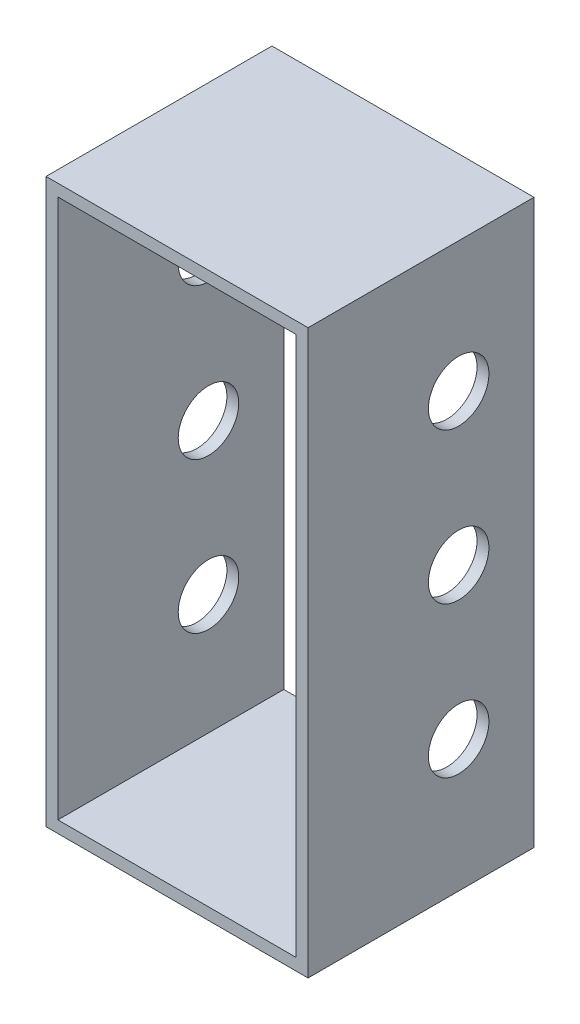
ISO-10303-21;
HEADER;
FILE_DESCRIPTION(('STEP AP214'),'2;1');
FILE_NAME('part.step','',(''),(''),'','','');
FILE_SCHEMA(('AUTOMOTIVE_DESIGN { 1 0 10303 214 1 1 1 1 }'));
ENDSEC;
DATA;
#1=APPLICATION_CONTEXT('core data for automotive mechanical design processes');
#2=APPLICATION_PROTOCOL_DEFINITION('international standard','automotive_design',2000,#1);
#3=PRODUCT_CONTEXT('',#1,'mechanical');
#4=PRODUCT('Part','Part','',(#3));
#5=PRODUCT_RELATED_PRODUCT_CATEGORY('part','',(#4));
#6=PRODUCT_DEFINITION_FORMATION('','',#4);
#7=PRODUCT_DEFINITION_CONTEXT('part definition',#1,'design');
#8=PRODUCT_DEFINITION('design','',#6,#7);
#9=PRODUCT_DEFINITION_SHAPE('','',#8);
#10=(LENGTH_UNIT() NAMED_UNIT(*) SI_UNIT(.MILLI.,.METRE.));
#11=(NAMED_UNIT(*) PLANE_ANGLE_UNIT() SI_UNIT($,.RADIAN.));
#12=(NAMED_UNIT(*) SI_UNIT($,.STERADIAN.) SOLID_ANGLE_UNIT());
#13=UNCERTAINTY_MEASURE_WITH_UNIT(LENGTH_MEASURE(1.E-05),#10,'distance_accuracy_value','');
#14=(GEOMETRIC_REPRESENTATION_CONTEXT(3) GLOBAL_UNCERTAINTY_ASSIGNED_CONTEXT((#13)) GLOBAL_UNIT_ASSIGNED_CONTEXT((#10,
#11,#12)) REPRESENTATION_CONTEXT('',''));
#15=CARTESIAN_POINT('',(0.,0.,0.));
#16=DIRECTION('',(0.,0.,1.));
#17=DIRECTION('',(1.,0.,0.));
#18=AXIS2_PLACEMENT_3D('',#15,#16,#17);
#19=CARTESIAN_POINT('',(0.,23.749,0.));
#20=DIRECTION('',(0.,0.,-1.));
#21=DIRECTION('',(-1.,0.,0.));
#22=AXIS2_PLACEMENT_3D('',#19,#20,#21);
#23=PLANE('',#22);
#24=DIRECTION('',(1.,0.,0.));
#25=VECTOR('',#24,1.);
#26=CARTESIAN_POINT('',(0.,-23.749,0.));
#27=LINE('',#26,#25);
#28=CARTESIAN_POINT('',(0.,-23.749,0.));
#29=VERTEX_POINT('',#28);
#30=CARTESIAN_POINT('',(22.098,-23.749,0.));
#31=VERTEX_POINT('',#30);
#32=EDGE_CURVE('E176',#29,#31,#27,.T.);
#33=ORIENTED_EDGE('',*,*,#32,.T.);
#34=DIRECTION('',(0.,-1.,0.));
#35=VECTOR('',#34,1.);
#36=CARTESIAN_POINT('',(22.098,23.749,0.));
#37=LINE('',#36,#35);
#38=CARTESIAN_POINT('',(22.098,23.749,0.));
#39=VERTEX_POINT('',#38);
#40=EDGE_CURVE('E41',#39,#31,#37,.T.);
#41=ORIENTED_EDGE('',*,*,#40,.F.);
#42=DIRECTION('',(1.,0.,0.));
#43=VECTOR('',#42,1.);
#44=CARTESIAN_POINT('',(0.,23.749,0.));
#45=LINE('',#44,#43);
#46=CARTESIAN_POINT('',(0.,23.749,0.));
#47=VERTEX_POINT('',#46);
#48=EDGE_CURVE('E166',#47,#39,#45,.T.);
#49=ORIENTED_EDGE('',*,*,#48,.F.);
#50=DIRECTION('',(0.,-1.,0.));
#51=VECTOR('',#50,1.);
#52=CARTESIAN_POINT('',(0.,23.749,0.));
#53=LINE('',#52,#51);
#54=EDGE_CURVE('E11',#47,#29,#53,.T.);
#55=ORIENTED_EDGE('',*,*,#54,.T.);
#56=EDGE_LOOP('',(#33,#41,#49,#55));
#57=FACE_BOUND('',#56,.T.);
#58=DIRECTION('',(1.,0.,0.));
#59=VECTOR('',#58,1.);
#60=CARTESIAN_POINT('',(0.,-22.748999968,0.));
#61=LINE('',#60,#59);
#62=CARTESIAN_POINT('',(1.000000032,-22.748999968,0.));
#63=VERTEX_POINT('',#62);
#64=CARTESIAN_POINT('',(21.097999968,-22.748999968,0.));
#65=VERTEX_POINT('',#64);
#66=EDGE_CURVE('E111',#63,#65,#61,.T.);
#67=ORIENTED_EDGE('',*,*,#66,.F.);
#68=DIRECTION('',(0.,-1.,0.));
#69=VECTOR('',#68,1.);
#70=CARTESIAN_POINT('',(1.000000032,23.749,0.));
#71=LINE('',#70,#69);
#72=CARTESIAN_POINT('',(1.000000032,22.748999968,0.));
#73=VERTEX_POINT('',#72);
#74=EDGE_CURVE('E98',#73,#63,#71,.T.);
#75=ORIENTED_EDGE('',*,*,#74,.F.);
#76=DIRECTION('',(1.,0.,0.));
#77=VECTOR('',#76,1.);
#78=CARTESIAN_POINT('',(0.,22.748999968,0.));
#79=LINE('',#78,#77);
#80=CARTESIAN_POINT('',(21.097999968,22.748999968,0.));
#81=VERTEX_POINT('',#80);
#82=EDGE_CURVE('E125',#73,#81,#79,.T.);
#83=ORIENTED_EDGE('',*,*,#82,.T.);
#84=DIRECTION('',(0.,-1.,0.));
#85=VECTOR('',#84,1.);
#86=CARTESIAN_POINT('',(21.097999968,23.749,0.));
#87=LINE('',#86,#85);
#88=EDGE_CURVE('E107',#81,#65,#87,.T.);
#89=ORIENTED_EDGE('',*,*,#88,.T.);
#90=EDGE_LOOP('',(#67,#75,#83,#89));
#91=FACE_BOUND('',#90,.T.);
#92=ADVANCED_FACE('F33',(#57,#91),#23,.F.);
#93=CARTESIAN_POINT('',(0.,23.749,-19.05));
#94=DIRECTION('',(0.,0.,1.));
#95=DIRECTION('',(1.,0.,0.));
#96=AXIS2_PLACEMENT_3D('',#93,#94,#95);
#97=PLANE('',#96);
#98=DIRECTION('',(-1.,0.,0.));
#99=VECTOR('',#98,1.);
#100=CARTESIAN_POINT('',(0.,-23.749,-19.05));
#101=LINE('',#100,#99);
#102=CARTESIAN_POINT('',(22.098,-23.749,-19.05));
#103=VERTEX_POINT('',#102);
#104=CARTESIAN_POINT('',(0.,-23.749,-19.05));
#105=VERTEX_POINT('',#104);
#106=EDGE_CURVE('E167',#103,#105,#101,.T.);
#107=ORIENTED_EDGE('',*,*,#106,.T.);
#108=DIRECTION('',(0.,-1.,0.));
#109=VECTOR('',#108,1.);
#110=CARTESIAN_POINT('',(0.,23.749,-19.05));
#111=LINE('',#110,#109);
#112=CARTESIAN_POINT('',(0.,23.749,-19.05));
#113=VERTEX_POINT('',#112);
#114=EDGE_CURVE('E173',#113,#105,#111,.T.);
#115=ORIENTED_EDGE('',*,*,#114,.F.);
#116=DIRECTION('',(-1.,0.,0.));
#117=VECTOR('',#116,1.);
#118=CARTESIAN_POINT('',(0.,23.749,-19.05));
#119=LINE('',#118,#117);
#120=CARTESIAN_POINT('',(22.098,23.749,-19.05));
#121=VERTEX_POINT('',#120);
#122=EDGE_CURVE('E171',#121,#113,#119,.T.);
#123=ORIENTED_EDGE('',*,*,#122,.F.);
#124=DIRECTION('',(0.,-1.,0.));
#125=VECTOR('',#124,1.);
#126=CARTESIAN_POINT('',(22.098,23.749,-19.05));
#127=LINE('',#126,#125);
#128=EDGE_CURVE('E183',#121,#103,#127,.T.);
#129=ORIENTED_EDGE('',*,*,#128,.T.);
#130=EDGE_LOOP('',(#107,#115,#123,#129));
#131=FACE_BOUND('',#130,.T.);
#132=DIRECTION('',(-1.,0.,0.));
#133=VECTOR('',#132,1.);
#134=CARTESIAN_POINT('',(0.,-22.748999968,-19.05));
#135=LINE('',#134,#133);
#136=CARTESIAN_POINT('',(21.097999968,-22.748999968,-19.05));
#137=VERTEX_POINT('',#136);
#138=CARTESIAN_POINT('',(1.000000032,-22.748999968,-19.05));
#139=VERTEX_POINT('',#138);
#140=EDGE_CURVE('E114',#137,#139,#135,.T.);
#141=ORIENTED_EDGE('',*,*,#140,.F.);
#142=DIRECTION('',(0.,-1.,0.));
#143=VECTOR('',#142,1.);
#144=CARTESIAN_POINT('',(21.097999968,23.749,-19.05));
#145=LINE('',#144,#143);
#146=CARTESIAN_POINT('',(21.097999968,22.748999968,-19.05));
#147=VERTEX_POINT('',#146);
#148=EDGE_CURVE('E124',#147,#137,#145,.T.);
#149=ORIENTED_EDGE('',*,*,#148,.F.);
#150=DIRECTION('',(-1.,0.,0.));
#151=VECTOR('',#150,1.);
#152=CARTESIAN_POINT('',(0.,22.748999968,-19.05));
#153=LINE('',#152,#151);
#154=CARTESIAN_POINT('',(1.000000032,22.748999968,-19.05));
#155=VERTEX_POINT('',#154);
#156=EDGE_CURVE('E55',#147,#155,#153,.T.);
#157=ORIENTED_EDGE('',*,*,#156,.T.);
#158=DIRECTION('',(0.,-1.,0.));
#159=VECTOR('',#158,1.);
#160=CARTESIAN_POINT('',(1.000000032,23.749,-19.05));
#161=LINE('',#160,#159);
#162=EDGE_CURVE('E128',#155,#139,#161,.T.);
#163=ORIENTED_EDGE('',*,*,#162,.T.);
#164=EDGE_LOOP('',(#141,#149,#157,#163));
#165=FACE_BOUND('',#164,.T.);
#166=ADVANCED_FACE('F199',(#131,#165),#97,.F.);
#167=CARTESIAN_POINT('',(22.098,0.0634999999999993,-12.7));
#168=DIRECTION('',(-1.,0.,0.));
#169=DIRECTION('',(0.,0.,1.));
#170=AXIS2_PLACEMENT_3D('',#167,#168,#169);
#171=CYLINDRICAL_SURFACE('',#170,2.5527);
#172=CARTESIAN_POINT('',(0.,0.0634999999999993,-12.7));
#173=DIRECTION('',(-1.,0.,0.));
#174=DIRECTION('',(0.,0.,1.));
#175=AXIS2_PLACEMENT_3D('',#172,#173,#174);
#176=CIRCLE('',#175,2.5527);
#177=CARTESIAN_POINT('',(0.,0.0634999999999993,-10.1473));
#178=VERTEX_POINT('',#177);
#179=EDGE_CURVE('E106',#178,#178,#176,.T.);
#180=ORIENTED_EDGE('',*,*,#179,.T.);
#181=EDGE_LOOP('',(#180));
#182=FACE_BOUND('',#181,.T.);
#183=CARTESIAN_POINT('',(1.000000032,0.0634999999999993,-12.7));
#184=DIRECTION('',(1.,0.,0.));
#185=DIRECTION('',(0.,0.,-1.));
#186=AXIS2_PLACEMENT_3D('',#183,#184,#185);
#187=CIRCLE('',#186,2.5527);
#188=CARTESIAN_POINT('',(1.000000032,0.0634999999999993,-15.2527));
#189=VERTEX_POINT('',#188);
#190=EDGE_CURVE('E144',#189,#189,#187,.F.);
#191=ORIENTED_EDGE('',*,*,#190,.F.);
#192=EDGE_LOOP('',(#191));
#193=FACE_BOUND('',#192,.T.);
#194=ADVANCED_FACE('F211',(#182,#193),#171,.F.);
#195=CARTESIAN_POINT('',(22.098,-12.6365,-12.7));
#196=DIRECTION('',(-1.,0.,0.));
#197=DIRECTION('',(0.,0.,1.));
#198=AXIS2_PLACEMENT_3D('',#195,#196,#197);
#199=CYLINDRICAL_SURFACE('',#198,2.5527);
#200=CARTESIAN_POINT('',(0.,-12.6365,-12.7));
#201=DIRECTION('',(-1.,0.,0.));
#202=DIRECTION('',(0.,0.,1.));
#203=AXIS2_PLACEMENT_3D('',#200,#201,#202);
#204=CIRCLE('',#203,2.5527);
#205=CARTESIAN_POINT('',(0.,-12.6365,-10.1473));
#206=VERTEX_POINT('',#205);
#207=EDGE_CURVE('E155',#206,#206,#204,.T.);
#208=ORIENTED_EDGE('',*,*,#207,.T.);
#209=EDGE_LOOP('',(#208));
#210=FACE_BOUND('',#209,.T.);
#211=CARTESIAN_POINT('',(1.000000032,-12.6365,-12.7));
#212=DIRECTION('',(1.,0.,0.));
#213=DIRECTION('',(0.,0.,-1.));
#214=AXIS2_PLACEMENT_3D('',#211,#212,#213);
#215=CIRCLE('',#214,2.5527);
#216=CARTESIAN_POINT('',(1.000000032,-12.6365,-15.2527));
#217=VERTEX_POINT('',#216);
#218=EDGE_CURVE('E140',#217,#217,#215,.F.);
#219=ORIENTED_EDGE('',*,*,#218,.F.);
#220=EDGE_LOOP('',(#219));
#221=FACE_BOUND('',#220,.T.);
#222=ADVANCED_FACE('F230',(#210,#221),#199,.F.);
#223=CARTESIAN_POINT('',(22.098,12.7635,-12.7));
#224=DIRECTION('',(-1.,0.,0.));
#225=DIRECTION('',(0.,0.,1.));
#226=AXIS2_PLACEMENT_3D('',#223,#224,#225);
#227=CYLINDRICAL_SURFACE('',#226,2.5527);
#228=CARTESIAN_POINT('',(0.,12.7635,-12.7));
#229=DIRECTION('',(-1.,0.,0.));
#230=DIRECTION('',(0.,0.,1.));
#231=AXIS2_PLACEMENT_3D('',#228,#229,#230);
#232=CIRCLE('',#231,2.5527);
#233=CARTESIAN_POINT('',(0.,12.7635,-10.1473));
#234=VERTEX_POINT('',#233);
#235=EDGE_CURVE('E149',#234,#234,#232,.T.);
#236=ORIENTED_EDGE('',*,*,#235,.T.);
#237=EDGE_LOOP('',(#236));
#238=FACE_BOUND('',#237,.T.);
#239=CARTESIAN_POINT('',(1.000000032,12.7635,-12.7));
#240=DIRECTION('',(1.,0.,0.));
#241=DIRECTION('',(0.,0.,-1.));
#242=AXIS2_PLACEMENT_3D('',#239,#240,#241);
#243=CIRCLE('',#242,2.5527);
#244=CARTESIAN_POINT('',(1.000000032,12.7635,-15.2527));
#245=VERTEX_POINT('',#244);
#246=EDGE_CURVE('E136',#245,#245,#243,.F.);
#247=ORIENTED_EDGE('',*,*,#246,.F.);
#248=EDGE_LOOP('',(#247));
#249=FACE_BOUND('',#248,.T.);
#250=ADVANCED_FACE('F234',(#238,#249),#227,.F.);
#251=CARTESIAN_POINT('',(0.,23.749,0.));
#252=DIRECTION('',(1.,0.,0.));
#253=DIRECTION('',(0.,0.,-1.));
#254=AXIS2_PLACEMENT_3D('',#251,#252,#253);
#255=PLANE('',#254);
#256=ORIENTED_EDGE('',*,*,#235,.F.);
#257=EDGE_LOOP('',(#256));
#258=FACE_BOUND('',#257,.T.);
#259=ORIENTED_EDGE('',*,*,#207,.F.);
#260=EDGE_LOOP('',(#259));
#261=FACE_BOUND('',#260,.T.);
#262=ORIENTED_EDGE('',*,*,#179,.F.);
#263=EDGE_LOOP('',(#262));
#264=FACE_BOUND('',#263,.T.);
#265=DIRECTION('',(0.,0.,1.));
#266=VECTOR('',#265,1.);
#267=CARTESIAN_POINT('',(0.,-23.749,0.));
#268=LINE('',#267,#266);
#269=EDGE_CURVE('E148',#105,#29,#268,.T.);
#270=ORIENTED_EDGE('',*,*,#269,.T.);
#271=ORIENTED_EDGE('',*,*,#54,.F.);
#272=DIRECTION('',(0.,0.,1.));
#273=VECTOR('',#272,1.);
#274=CARTESIAN_POINT('',(0.,23.749,0.));
#275=LINE('',#274,#273);
#276=EDGE_CURVE('E163',#113,#47,#275,.T.);
#277=ORIENTED_EDGE('',*,*,#276,.F.);
#278=ORIENTED_EDGE('',*,*,#114,.T.);
#279=EDGE_LOOP('',(#270,#271,#277,#278));
#280=FACE_BOUND('',#279,.T.);
#281=ADVANCED_FACE('F35',(#258,#261,#264,#280),#255,.F.);
#282=CARTESIAN_POINT('',(22.098,23.749,0.));
#283=DIRECTION('',(-1.,0.,0.));
#284=DIRECTION('',(0.,0.,1.));
#285=AXIS2_PLACEMENT_3D('',#282,#283,#284);
#286=PLANE('',#285);
#287=CARTESIAN_POINT('',(22.098,12.7635,-12.7));
#288=DIRECTION('',(-1.,0.,0.));
#289=DIRECTION('',(0.,0.,1.));
#290=AXIS2_PLACEMENT_3D('',#287,#288,#289);
#291=CIRCLE('',#290,2.5527);
#292=CARTESIAN_POINT('',(22.098,12.7635,-10.1473));
#293=VERTEX_POINT('',#292);
#294=EDGE_CURVE('E145',#293,#293,#291,.T.);
#295=ORIENTED_EDGE('',*,*,#294,.T.);
#296=EDGE_LOOP('',(#295));
#297=FACE_BOUND('',#296,.T.);
#298=CARTESIAN_POINT('',(22.098,-12.6365,-12.7));
#299=DIRECTION('',(-1.,0.,0.));
#300=DIRECTION('',(0.,0.,1.));
#301=AXIS2_PLACEMENT_3D('',#298,#299,#300);
#302=CIRCLE('',#301,2.5527);
#303=CARTESIAN_POINT('',(22.098,-12.6365,-10.1473));
#304=VERTEX_POINT('',#303);
#305=EDGE_CURVE('E152',#304,#304,#302,.T.);
#306=ORIENTED_EDGE('',*,*,#305,.T.);
#307=EDGE_LOOP('',(#306));
#308=FACE_BOUND('',#307,.T.);
#309=CARTESIAN_POINT('',(22.098,0.0634999999999993,-12.7));
#310=DIRECTION('',(-1.,0.,0.));
#311=DIRECTION('',(0.,0.,1.));
#312=AXIS2_PLACEMENT_3D('',#309,#310,#311);
#313=CIRCLE('',#312,2.5527);
#314=CARTESIAN_POINT('',(22.098,0.0634999999999993,-10.1473));
#315=VERTEX_POINT('',#314);
#316=EDGE_CURVE('E158',#315,#315,#313,.T.);
#317=ORIENTED_EDGE('',*,*,#316,.T.);
#318=EDGE_LOOP('',(#317));
#319=FACE_BOUND('',#318,.T.);
#320=DIRECTION('',(0.,0.,-1.));
#321=VECTOR('',#320,1.);
#322=CARTESIAN_POINT('',(22.098,-23.749,0.));
#323=LINE('',#322,#321);
#324=EDGE_CURVE('E178',#31,#103,#323,.T.);
#325=ORIENTED_EDGE('',*,*,#324,.T.);
#326=ORIENTED_EDGE('',*,*,#128,.F.);
#327=DIRECTION('',(0.,0.,-1.));
#328=VECTOR('',#327,1.);
#329=CARTESIAN_POINT('',(22.098,23.749,0.));
#330=LINE('',#329,#328);
#331=EDGE_CURVE('E169',#39,#121,#330,.T.);
#332=ORIENTED_EDGE('',*,*,#331,.F.);
#333=ORIENTED_EDGE('',*,*,#40,.T.);
#334=EDGE_LOOP('',(#325,#326,#332,#333));
#335=FACE_BOUND('',#334,.T.);
#336=ADVANCED_FACE('F190',(#297,#308,#319,#335),#286,.F.);
#337=CARTESIAN_POINT('',(0.,23.749,0.));
#338=DIRECTION('',(0.,-1.,0.));
#339=DIRECTION('',(0.,0.,-1.));
#340=AXIS2_PLACEMENT_3D('',#337,#338,#339);
#341=PLANE('',#340);
#342=ORIENTED_EDGE('',*,*,#276,.T.);
#343=ORIENTED_EDGE('',*,*,#48,.T.);
#344=ORIENTED_EDGE('',*,*,#331,.T.);
#345=ORIENTED_EDGE('',*,*,#122,.T.);
#346=EDGE_LOOP('',(#342,#343,#344,#345));
#347=FACE_BOUND('',#346,.T.);
#348=ADVANCED_FACE('F206',(#347),#341,.F.);
#349=CARTESIAN_POINT('',(0.,-23.749,0.));
#350=DIRECTION('',(0.,-1.,0.));
#351=DIRECTION('',(0.,0.,-1.));
#352=AXIS2_PLACEMENT_3D('',#349,#350,#351);
#353=PLANE('',#352);
#354=ORIENTED_EDGE('',*,*,#269,.F.);
#355=ORIENTED_EDGE('',*,*,#106,.F.);
#356=ORIENTED_EDGE('',*,*,#324,.F.);
#357=ORIENTED_EDGE('',*,*,#32,.F.);
#358=EDGE_LOOP('',(#354,#355,#356,#357));
#359=FACE_BOUND('',#358,.T.);
#360=ADVANCED_FACE('F196',(#359),#353,.T.);
#361=CARTESIAN_POINT('',(21.097999968,0.0634999999999993,-12.7));
#362=DIRECTION('',(-1.,0.,0.));
#363=DIRECTION('',(0.,0.,1.));
#364=AXIS2_PLACEMENT_3D('',#361,#362,#363);
#365=CIRCLE('',#364,2.5527);
#366=CARTESIAN_POINT('',(21.097999968,0.0634999999999993,-10.1473));
#367=VERTEX_POINT('',#366);
#368=EDGE_CURVE('E141',#367,#367,#365,.T.);
#369=ORIENTED_EDGE('',*,*,#368,.T.);
#370=EDGE_LOOP('',(#369));
#371=FACE_BOUND('',#370,.T.);
#372=ORIENTED_EDGE('',*,*,#316,.F.);
#373=EDGE_LOOP('',(#372));
#374=FACE_BOUND('',#373,.T.);
#375=ADVANCED_FACE('F219',(#371,#374),#171,.F.);
#376=CARTESIAN_POINT('',(21.097999968,-12.6365,-12.7));
#377=DIRECTION('',(-1.,0.,0.));
#378=DIRECTION('',(0.,0.,1.));
#379=AXIS2_PLACEMENT_3D('',#376,#377,#378);
#380=CIRCLE('',#379,2.5527);
#381=CARTESIAN_POINT('',(21.097999968,-12.6365,-10.1473));
#382=VERTEX_POINT('',#381);
#383=EDGE_CURVE('E137',#382,#382,#380,.T.);
#384=ORIENTED_EDGE('',*,*,#383,.T.);
#385=EDGE_LOOP('',(#384));
#386=FACE_BOUND('',#385,.T.);
#387=ORIENTED_EDGE('',*,*,#305,.F.);
#388=EDGE_LOOP('',(#387));
#389=FACE_BOUND('',#388,.T.);
#390=ADVANCED_FACE('F224',(#386,#389),#199,.F.);
#391=CARTESIAN_POINT('',(21.097999968,12.7635,-12.7));
#392=DIRECTION('',(-1.,0.,0.));
#393=DIRECTION('',(0.,0.,1.));
#394=AXIS2_PLACEMENT_3D('',#391,#392,#393);
#395=CIRCLE('',#394,2.5527);
#396=CARTESIAN_POINT('',(21.097999968,12.7635,-10.1473));
#397=VERTEX_POINT('',#396);
#398=EDGE_CURVE('E115',#397,#397,#395,.T.);
#399=ORIENTED_EDGE('',*,*,#398,.T.);
#400=EDGE_LOOP('',(#399));
#401=FACE_BOUND('',#400,.T.);
#402=ORIENTED_EDGE('',*,*,#294,.F.);
#403=EDGE_LOOP('',(#402));
#404=FACE_BOUND('',#403,.T.);
#405=ADVANCED_FACE('F228',(#401,#404),#227,.F.);
#406=CARTESIAN_POINT('',(1.000000032,23.749,0.));
#407=DIRECTION('',(1.,0.,0.));
#408=DIRECTION('',(0.,0.,-1.));
#409=AXIS2_PLACEMENT_3D('',#406,#407,#408);
#410=PLANE('',#409);
#411=ORIENTED_EDGE('',*,*,#246,.T.);
#412=EDGE_LOOP('',(#411));
#413=FACE_BOUND('',#412,.T.);
#414=ORIENTED_EDGE('',*,*,#218,.T.);
#415=EDGE_LOOP('',(#414));
#416=FACE_BOUND('',#415,.T.);
#417=ORIENTED_EDGE('',*,*,#190,.T.);
#418=EDGE_LOOP('',(#417));
#419=FACE_BOUND('',#418,.T.);
#420=DIRECTION('',(0.,0.,1.));
#421=VECTOR('',#420,1.);
#422=CARTESIAN_POINT('',(1.000000032,-22.748999968,0.));
#423=LINE('',#422,#421);
#424=EDGE_CURVE('E101',#139,#63,#423,.T.);
#425=ORIENTED_EDGE('',*,*,#424,.F.);
#426=ORIENTED_EDGE('',*,*,#162,.F.);
#427=DIRECTION('',(0.,0.,1.));
#428=VECTOR('',#427,1.);
#429=CARTESIAN_POINT('',(1.000000032,22.748999968,0.));
#430=LINE('',#429,#428);
#431=EDGE_CURVE('E48',#155,#73,#430,.T.);
#432=ORIENTED_EDGE('',*,*,#431,.T.);
#433=ORIENTED_EDGE('',*,*,#74,.T.);
#434=EDGE_LOOP('',(#425,#426,#432,#433));
#435=FACE_BOUND('',#434,.T.);
#436=ADVANCED_FACE('F100',(#413,#416,#419,#435),#410,.T.);
#437=CARTESIAN_POINT('',(21.097999968,23.749,0.));
#438=DIRECTION('',(-1.,0.,0.));
#439=DIRECTION('',(0.,0.,1.));
#440=AXIS2_PLACEMENT_3D('',#437,#438,#439);
#441=PLANE('',#440);
#442=ORIENTED_EDGE('',*,*,#398,.F.);
#443=EDGE_LOOP('',(#442));
#444=FACE_BOUND('',#443,.T.);
#445=ORIENTED_EDGE('',*,*,#383,.F.);
#446=EDGE_LOOP('',(#445));
#447=FACE_BOUND('',#446,.T.);
#448=ORIENTED_EDGE('',*,*,#368,.F.);
#449=EDGE_LOOP('',(#448));
#450=FACE_BOUND('',#449,.T.);
#451=DIRECTION('',(0.,0.,-1.));
#452=VECTOR('',#451,1.);
#453=CARTESIAN_POINT('',(21.097999968,-22.748999968,0.));
#454=LINE('',#453,#452);
#455=EDGE_CURVE('E118',#65,#137,#454,.T.);
#456=ORIENTED_EDGE('',*,*,#455,.F.);
#457=ORIENTED_EDGE('',*,*,#88,.F.);
#458=DIRECTION('',(0.,0.,-1.));
#459=VECTOR('',#458,1.);
#460=CARTESIAN_POINT('',(21.097999968,22.748999968,0.));
#461=LINE('',#460,#459);
#462=EDGE_CURVE('E127',#81,#147,#461,.T.);
#463=ORIENTED_EDGE('',*,*,#462,.T.);
#464=ORIENTED_EDGE('',*,*,#148,.T.);
#465=EDGE_LOOP('',(#456,#457,#463,#464));
#466=FACE_BOUND('',#465,.T.);
#467=ADVANCED_FACE('F240',(#444,#447,#450,#466),#441,.T.);
#468=CARTESIAN_POINT('',(0.,22.748999968,0.));
#469=DIRECTION('',(0.,-1.,0.));
#470=DIRECTION('',(0.,0.,-1.));
#471=AXIS2_PLACEMENT_3D('',#468,#469,#470);
#472=PLANE('',#471);
#473=ORIENTED_EDGE('',*,*,#431,.F.);
#474=ORIENTED_EDGE('',*,*,#156,.F.);
#475=ORIENTED_EDGE('',*,*,#462,.F.);
#476=ORIENTED_EDGE('',*,*,#82,.F.);
#477=EDGE_LOOP('',(#473,#474,#475,#476));
#478=FACE_BOUND('',#477,.T.);
#479=ADVANCED_FACE('F237',(#478),#472,.T.);
#480=CARTESIAN_POINT('',(0.,-22.748999968,0.));
#481=DIRECTION('',(0.,-1.,0.));
#482=DIRECTION('',(0.,0.,-1.));
#483=AXIS2_PLACEMENT_3D('',#480,#481,#482);
#484=PLANE('',#483);
#485=ORIENTED_EDGE('',*,*,#424,.T.);
#486=ORIENTED_EDGE('',*,*,#66,.T.);
#487=ORIENTED_EDGE('',*,*,#455,.T.);
#488=ORIENTED_EDGE('',*,*,#140,.T.);
#489=EDGE_LOOP('',(#485,#486,#487,#488));
#490=FACE_BOUND('',#489,.T.);
#491=ADVANCED_FACE('F110',(#490),#484,.F.);
#492=CLOSED_SHELL('',(#92,#166,#194,#222,#250,#281,#336,#348,#360,#375,#390,#405,#436,#467,#479,#491));
#493=MANIFOLD_SOLID_BREP('B2',#492);
#494=ADVANCED_BREP_SHAPE_REPRESENTATION('',(#18,#493),#14);
#495=SHAPE_DEFINITION_REPRESENTATION(#9,#494);
ENDSEC;
END-ISO-10303-21;
